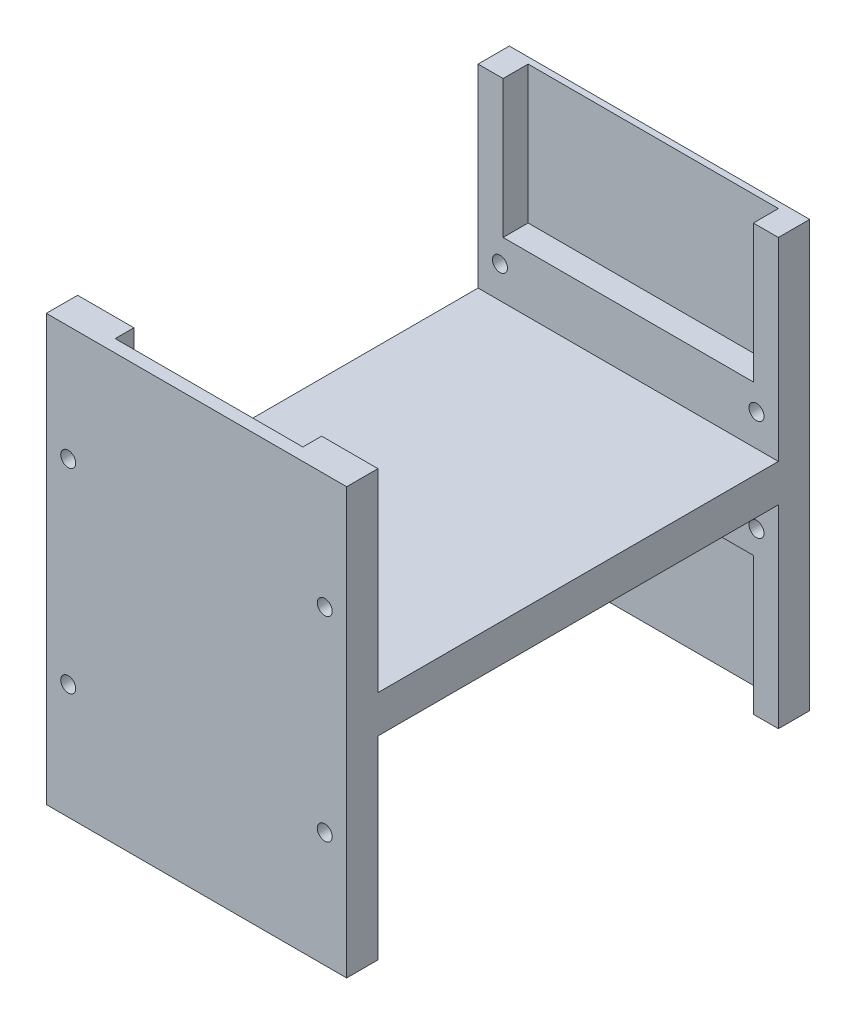
ISO-10303-21;
HEADER;
FILE_DESCRIPTION(('STEP AP214'),'2;1');
FILE_NAME('part.step','',(''),(''),'','','');
FILE_SCHEMA(('AUTOMOTIVE_DESIGN { 1 0 10303 214 1 1 1 1 }'));
ENDSEC;
DATA;
#1=APPLICATION_CONTEXT('core data for automotive mechanical design processes');
#2=APPLICATION_PROTOCOL_DEFINITION('international standard','automotive_design',2000,#1);
#3=PRODUCT_CONTEXT('',#1,'mechanical');
#4=PRODUCT('Part','Part','',(#3));
#5=PRODUCT_RELATED_PRODUCT_CATEGORY('part','',(#4));
#6=PRODUCT_DEFINITION_FORMATION('','',#4);
#7=PRODUCT_DEFINITION_CONTEXT('part definition',#1,'design');
#8=PRODUCT_DEFINITION('design','',#6,#7);
#9=PRODUCT_DEFINITION_SHAPE('','',#8);
#10=(LENGTH_UNIT() NAMED_UNIT(*) SI_UNIT(.MILLI.,.METRE.));
#11=(NAMED_UNIT(*) PLANE_ANGLE_UNIT() SI_UNIT($,.RADIAN.));
#12=(NAMED_UNIT(*) SI_UNIT($,.STERADIAN.) SOLID_ANGLE_UNIT());
#13=UNCERTAINTY_MEASURE_WITH_UNIT(LENGTH_MEASURE(1.E-05),#10,'distance_accuracy_value','');
#14=(GEOMETRIC_REPRESENTATION_CONTEXT(3) GLOBAL_UNCERTAINTY_ASSIGNED_CONTEXT((#13)) GLOBAL_UNIT_ASSIGNED_CONTEXT((#10,
#11,#12)) REPRESENTATION_CONTEXT('',''));
#15=CARTESIAN_POINT('',(0.,0.,0.));
#16=DIRECTION('',(0.,0.,1.));
#17=DIRECTION('',(1.,0.,0.));
#18=AXIS2_PLACEMENT_3D('',#15,#16,#17);
#19=CARTESIAN_POINT('',(0.,0.,37.));
#20=DIRECTION('',(1.,0.,0.));
#21=DIRECTION('',(0.,0.,-1.));
#22=AXIS2_PLACEMENT_3D('',#19,#20,#21);
#23=PLANE('',#22);
#24=DIRECTION('',(0.,-1.,0.));
#25=VECTOR('',#24,1.);
#26=CARTESIAN_POINT('',(0.,57.,34.5));
#27=LINE('',#26,#25);
#28=CARTESIAN_POINT('',(0.,15.5,34.5));
#29=VERTEX_POINT('',#28);
#30=CARTESIAN_POINT('',(0.,0.,34.5));
#31=VERTEX_POINT('',#30);
#32=EDGE_CURVE('E438',#29,#31,#27,.T.);
#33=ORIENTED_EDGE('',*,*,#32,.T.);
#34=DIRECTION('',(0.,0.,-1.));
#35=VECTOR('',#34,1.);
#36=CARTESIAN_POINT('',(0.,0.,37.));
#37=LINE('',#36,#35);
#38=CARTESIAN_POINT('',(0.,0.,37.));
#39=VERTEX_POINT('',#38);
#40=EDGE_CURVE('E12',#39,#31,#37,.T.);
#41=ORIENTED_EDGE('',*,*,#40,.F.);
#42=DIRECTION('',(0.,-1.,0.));
#43=VECTOR('',#42,1.);
#44=CARTESIAN_POINT('',(0.,0.,37.));
#45=LINE('',#44,#43);
#46=CARTESIAN_POINT('',(0.,34.,37.));
#47=VERTEX_POINT('',#46);
#48=EDGE_CURVE('E463',#47,#39,#45,.T.);
#49=ORIENTED_EDGE('',*,*,#48,.F.);
#50=DIRECTION('',(0.,0.,-1.));
#51=VECTOR('',#50,1.);
#52=CARTESIAN_POINT('',(0.,34.,37.));
#53=LINE('',#52,#51);
#54=CARTESIAN_POINT('',(0.,34.,34.5));
#55=VERTEX_POINT('',#54);
#56=EDGE_CURVE('E356',#47,#55,#53,.T.);
#57=ORIENTED_EDGE('',*,*,#56,.T.);
#58=DIRECTION('',(0.,1.,0.));
#59=VECTOR('',#58,1.);
#60=CARTESIAN_POINT('',(0.,-23.,34.5));
#61=LINE('',#60,#59);
#62=CARTESIAN_POINT('',(0.,18.5,34.5));
#63=VERTEX_POINT('',#62);
#64=EDGE_CURVE('E322',#63,#55,#61,.T.);
#65=ORIENTED_EDGE('',*,*,#64,.F.);
#66=DIRECTION('',(0.,0.,1.));
#67=VECTOR('',#66,1.);
#68=CARTESIAN_POINT('',(0.,18.5,0.));
#69=LINE('',#68,#67);
#70=CARTESIAN_POINT('',(0.,18.5,2.5));
#71=VERTEX_POINT('',#70);
#72=EDGE_CURVE('E324',#71,#63,#69,.T.);
#73=ORIENTED_EDGE('',*,*,#72,.F.);
#74=DIRECTION('',(0.,1.,0.));
#75=VECTOR('',#74,1.);
#76=CARTESIAN_POINT('',(0.,-23.,2.5));
#77=LINE('',#76,#75);
#78=CARTESIAN_POINT('',(0.,34.,2.5));
#79=VERTEX_POINT('',#78);
#80=EDGE_CURVE('E334',#71,#79,#77,.T.);
#81=ORIENTED_EDGE('',*,*,#80,.T.);
#82=CARTESIAN_POINT('',(0.,34.,0.));
#83=VERTEX_POINT('',#82);
#84=EDGE_CURVE('E355',#79,#83,#53,.T.);
#85=ORIENTED_EDGE('',*,*,#84,.T.);
#86=DIRECTION('',(0.,-1.,0.));
#87=VECTOR('',#86,1.);
#88=CARTESIAN_POINT('',(0.,0.,0.));
#89=LINE('',#88,#87);
#90=CARTESIAN_POINT('',(0.,0.,0.));
#91=VERTEX_POINT('',#90);
#92=EDGE_CURVE('E462',#83,#91,#89,.T.);
#93=ORIENTED_EDGE('',*,*,#92,.T.);
#94=CARTESIAN_POINT('',(0.,0.,2.5));
#95=VERTEX_POINT('',#94);
#96=EDGE_CURVE('E44',#95,#91,#37,.T.);
#97=ORIENTED_EDGE('',*,*,#96,.F.);
#98=DIRECTION('',(0.,-1.,0.));
#99=VECTOR('',#98,1.);
#100=CARTESIAN_POINT('',(0.,57.,2.5));
#101=LINE('',#100,#99);
#102=CARTESIAN_POINT('',(0.,15.5,2.5));
#103=VERTEX_POINT('',#102);
#104=EDGE_CURVE('E451',#103,#95,#101,.T.);
#105=ORIENTED_EDGE('',*,*,#104,.F.);
#106=DIRECTION('',(0.,0.,1.));
#107=VECTOR('',#106,1.);
#108=CARTESIAN_POINT('',(0.,15.5,0.));
#109=LINE('',#108,#107);
#110=EDGE_CURVE('E440',#103,#29,#109,.T.);
#111=ORIENTED_EDGE('',*,*,#110,.T.);
#112=EDGE_LOOP('',(#33,#41,#49,#57,#65,#73,#81,#85,#93,#97,#105,#111));
#113=FACE_BOUND('',#112,.T.);
#114=ADVANCED_FACE('F37',(#113),#23,.F.);
#115=CARTESIAN_POINT('',(0.,0.,37.));
#116=DIRECTION('',(0.,1.,0.));
#117=DIRECTION('',(0.,0.,1.));
#118=AXIS2_PLACEMENT_3D('',#115,#116,#117);
#119=PLANE('',#118);
#120=DIRECTION('',(1.,0.,0.));
#121=VECTOR('',#120,1.);
#122=CARTESIAN_POINT('',(0.,0.,34.5));
#123=LINE('',#122,#121);
#124=CARTESIAN_POINT('',(4.5,0.,34.5));
#125=VERTEX_POINT('',#124);
#126=EDGE_CURVE('E448',#31,#125,#123,.T.);
#127=ORIENTED_EDGE('',*,*,#126,.T.);
#128=DIRECTION('',(0.,0.,-1.));
#129=VECTOR('',#128,1.);
#130=CARTESIAN_POINT('',(4.5,0.,36.));
#131=LINE('',#130,#129);
#132=CARTESIAN_POINT('',(4.5,0.,36.));
#133=VERTEX_POINT('',#132);
#134=EDGE_CURVE('E359',#133,#125,#131,.T.);
#135=ORIENTED_EDGE('',*,*,#134,.F.);
#136=DIRECTION('',(-1.,0.,0.));
#137=VECTOR('',#136,1.);
#138=CARTESIAN_POINT('',(4.5,0.,36.));
#139=LINE('',#138,#137);
#140=CARTESIAN_POINT('',(19.5,0.,36.));
#141=VERTEX_POINT('',#140);
#142=EDGE_CURVE('E362',#141,#133,#139,.T.);
#143=ORIENTED_EDGE('',*,*,#142,.F.);
#144=DIRECTION('',(0.,0.,1.));
#145=VECTOR('',#144,1.);
#146=CARTESIAN_POINT('',(19.5,0.,36.));
#147=LINE('',#146,#145);
#148=CARTESIAN_POINT('',(19.5,0.,34.5));
#149=VERTEX_POINT('',#148);
#150=EDGE_CURVE('E371',#149,#141,#147,.T.);
#151=ORIENTED_EDGE('',*,*,#150,.F.);
#152=CARTESIAN_POINT('',(24.,0.,34.5));
#153=VERTEX_POINT('',#152);
#154=EDGE_CURVE('E447',#149,#153,#123,.T.);
#155=ORIENTED_EDGE('',*,*,#154,.T.);
#156=DIRECTION('',(0.,0.,-1.));
#157=VECTOR('',#156,1.);
#158=CARTESIAN_POINT('',(24.,0.,37.));
#159=LINE('',#158,#157);
#160=CARTESIAN_POINT('',(24.,0.,37.));
#161=VERTEX_POINT('',#160);
#162=EDGE_CURVE('E477',#161,#153,#159,.T.);
#163=ORIENTED_EDGE('',*,*,#162,.F.);
#164=DIRECTION('',(1.,0.,0.));
#165=VECTOR('',#164,1.);
#166=CARTESIAN_POINT('',(0.,0.,37.));
#167=LINE('',#166,#165);
#168=EDGE_CURVE('E466',#39,#161,#167,.T.);
#169=ORIENTED_EDGE('',*,*,#168,.F.);
#170=ORIENTED_EDGE('',*,*,#40,.T.);
#171=EDGE_LOOP('',(#127,#135,#143,#151,#155,#163,#169,#170));
#172=FACE_BOUND('',#171,.T.);
#173=ADVANCED_FACE('F527',(#172),#119,.F.);
#174=CARTESIAN_POINT('',(24.,0.,37.));
#175=DIRECTION('',(-1.,0.,0.));
#176=DIRECTION('',(0.,0.,1.));
#177=AXIS2_PLACEMENT_3D('',#174,#175,#176);
#178=PLANE('',#177);
#179=DIRECTION('',(0.,-1.,0.));
#180=VECTOR('',#179,1.);
#181=CARTESIAN_POINT('',(24.,57.,34.5));
#182=LINE('',#181,#180);
#183=CARTESIAN_POINT('',(24.,15.5,34.5));
#184=VERTEX_POINT('',#183);
#185=EDGE_CURVE('E454',#184,#153,#182,.T.);
#186=ORIENTED_EDGE('',*,*,#185,.F.);
#187=DIRECTION('',(0.,0.,-1.));
#188=VECTOR('',#187,1.);
#189=CARTESIAN_POINT('',(24.,15.5,0.));
#190=LINE('',#189,#188);
#191=CARTESIAN_POINT('',(24.,15.5,2.5));
#192=VERTEX_POINT('',#191);
#193=EDGE_CURVE('E434',#184,#192,#190,.T.);
#194=ORIENTED_EDGE('',*,*,#193,.T.);
#195=DIRECTION('',(0.,-1.,0.));
#196=VECTOR('',#195,1.);
#197=CARTESIAN_POINT('',(24.,57.,2.5));
#198=LINE('',#197,#196);
#199=CARTESIAN_POINT('',(24.,0.,2.5));
#200=VERTEX_POINT('',#199);
#201=EDGE_CURVE('E457',#192,#200,#198,.T.);
#202=ORIENTED_EDGE('',*,*,#201,.T.);
#203=CARTESIAN_POINT('',(24.,0.,0.));
#204=VERTEX_POINT('',#203);
#205=EDGE_CURVE('E471',#200,#204,#159,.T.);
#206=ORIENTED_EDGE('',*,*,#205,.T.);
#207=DIRECTION('',(0.,1.,0.));
#208=VECTOR('',#207,1.);
#209=CARTESIAN_POINT('',(24.,0.,0.));
#210=LINE('',#209,#208);
#211=CARTESIAN_POINT('',(24.,34.,0.));
#212=VERTEX_POINT('',#211);
#213=EDGE_CURVE('E467',#204,#212,#210,.T.);
#214=ORIENTED_EDGE('',*,*,#213,.T.);
#215=DIRECTION('',(0.,0.,-1.));
#216=VECTOR('',#215,1.);
#217=CARTESIAN_POINT('',(24.,34.,37.));
#218=LINE('',#217,#216);
#219=CARTESIAN_POINT('',(24.,34.,2.5));
#220=VERTEX_POINT('',#219);
#221=EDGE_CURVE('E349',#220,#212,#218,.T.);
#222=ORIENTED_EDGE('',*,*,#221,.F.);
#223=DIRECTION('',(0.,1.,0.));
#224=VECTOR('',#223,1.);
#225=CARTESIAN_POINT('',(24.,-23.,2.5));
#226=LINE('',#225,#224);
#227=CARTESIAN_POINT('',(24.,18.5,2.5));
#228=VERTEX_POINT('',#227);
#229=EDGE_CURVE('E339',#228,#220,#226,.T.);
#230=ORIENTED_EDGE('',*,*,#229,.F.);
#231=DIRECTION('',(0.,0.,-1.));
#232=VECTOR('',#231,1.);
#233=CARTESIAN_POINT('',(24.,18.5,0.));
#234=LINE('',#233,#232);
#235=CARTESIAN_POINT('',(24.,18.5,34.5));
#236=VERTEX_POINT('',#235);
#237=EDGE_CURVE('E318',#236,#228,#234,.T.);
#238=ORIENTED_EDGE('',*,*,#237,.F.);
#239=DIRECTION('',(0.,1.,0.));
#240=VECTOR('',#239,1.);
#241=CARTESIAN_POINT('',(24.,-23.,34.5));
#242=LINE('',#241,#240);
#243=CARTESIAN_POINT('',(24.,34.,34.5));
#244=VERTEX_POINT('',#243);
#245=EDGE_CURVE('E337',#236,#244,#242,.T.);
#246=ORIENTED_EDGE('',*,*,#245,.T.);
#247=CARTESIAN_POINT('',(24.,34.,37.));
#248=VERTEX_POINT('',#247);
#249=EDGE_CURVE('E352',#248,#244,#218,.T.);
#250=ORIENTED_EDGE('',*,*,#249,.F.);
#251=DIRECTION('',(0.,1.,0.));
#252=VECTOR('',#251,1.);
#253=CARTESIAN_POINT('',(24.,0.,37.));
#254=LINE('',#253,#252);
#255=EDGE_CURVE('E469',#161,#248,#254,.T.);
#256=ORIENTED_EDGE('',*,*,#255,.F.);
#257=ORIENTED_EDGE('',*,*,#162,.T.);
#258=EDGE_LOOP('',(#186,#194,#202,#206,#214,#222,#230,#238,#246,#250,#256,#257));
#259=FACE_BOUND('',#258,.T.);
#260=ADVANCED_FACE('F484',(#259),#178,.F.);
#261=DIRECTION('',(1.,0.,0.));
#262=VECTOR('',#261,1.);
#263=CARTESIAN_POINT('',(2.,0.,0.499999999999995));
#264=LINE('',#263,#262);
#265=CARTESIAN_POINT('',(2.,0.,0.499999999999995));
#266=VERTEX_POINT('',#265);
#267=CARTESIAN_POINT('',(22.,0.,0.499999999999998));
#268=VERTEX_POINT('',#267);
#269=EDGE_CURVE('E397',#266,#268,#264,.T.);
#270=ORIENTED_EDGE('',*,*,#269,.F.);
#271=DIRECTION('',(0.,0.,-1.));
#272=VECTOR('',#271,1.);
#273=CARTESIAN_POINT('',(2.,0.,2.5));
#274=LINE('',#273,#272);
#275=CARTESIAN_POINT('',(2.,0.,2.5));
#276=VERTEX_POINT('',#275);
#277=EDGE_CURVE('E378',#276,#266,#274,.T.);
#278=ORIENTED_EDGE('',*,*,#277,.F.);
#279=DIRECTION('',(1.,0.,0.));
#280=VECTOR('',#279,1.);
#281=CARTESIAN_POINT('',(0.,0.,2.5));
#282=LINE('',#281,#280);
#283=EDGE_CURVE('E444',#95,#276,#282,.T.);
#284=ORIENTED_EDGE('',*,*,#283,.F.);
#285=ORIENTED_EDGE('',*,*,#96,.T.);
#286=DIRECTION('',(1.,0.,0.));
#287=VECTOR('',#286,1.);
#288=CARTESIAN_POINT('',(0.,0.,0.));
#289=LINE('',#288,#287);
#290=EDGE_CURVE('E474',#91,#204,#289,.T.);
#291=ORIENTED_EDGE('',*,*,#290,.T.);
#292=ORIENTED_EDGE('',*,*,#205,.F.);
#293=CARTESIAN_POINT('',(22.,0.,2.5));
#294=VERTEX_POINT('',#293);
#295=EDGE_CURVE('E429',#294,#200,#282,.T.);
#296=ORIENTED_EDGE('',*,*,#295,.F.);
#297=DIRECTION('',(0.,0.,1.));
#298=VECTOR('',#297,1.);
#299=CARTESIAN_POINT('',(22.,0.,2.5));
#300=LINE('',#299,#298);
#301=EDGE_CURVE('E389',#268,#294,#300,.T.);
#302=ORIENTED_EDGE('',*,*,#301,.F.);
#303=EDGE_LOOP('',(#270,#278,#284,#285,#291,#292,#296,#302));
#304=FACE_BOUND('',#303,.T.);
#305=ADVANCED_FACE('F492',(#304),#119,.F.);
#306=CARTESIAN_POINT('',(0.,0.,37.));
#307=DIRECTION('',(0.,0.,-1.));
#308=DIRECTION('',(-1.,0.,0.));
#309=AXIS2_PLACEMENT_3D('',#306,#307,#308);
#310=PLANE('',#309);
#311=CARTESIAN_POINT('',(1.75,9.2,37.));
#312=DIRECTION('',(0.,0.,1.));
#313=DIRECTION('',(1.,0.,0.));
#314=AXIS2_PLACEMENT_3D('',#311,#312,#313);
#315=CIRCLE('',#314,0.6);
#316=CARTESIAN_POINT('',(2.35,9.2,37.));
#317=VERTEX_POINT('',#316);
#318=EDGE_CURVE('E425',#317,#317,#315,.T.);
#319=ORIENTED_EDGE('',*,*,#318,.F.);
#320=EDGE_LOOP('',(#319));
#321=FACE_BOUND('',#320,.T.);
#322=CARTESIAN_POINT('',(22.25,9.2,37.));
#323=DIRECTION('',(0.,0.,1.));
#324=DIRECTION('',(1.,0.,0.));
#325=AXIS2_PLACEMENT_3D('',#322,#323,#324);
#326=CIRCLE('',#325,0.6);
#327=CARTESIAN_POINT('',(22.85,9.2,37.));
#328=VERTEX_POINT('',#327);
#329=EDGE_CURVE('E426',#328,#328,#326,.T.);
#330=ORIENTED_EDGE('',*,*,#329,.F.);
#331=EDGE_LOOP('',(#330));
#332=FACE_BOUND('',#331,.T.);
#333=ORIENTED_EDGE('',*,*,#48,.T.);
#334=ORIENTED_EDGE('',*,*,#168,.T.);
#335=ORIENTED_EDGE('',*,*,#255,.T.);
#336=DIRECTION('',(1.,0.,0.));
#337=VECTOR('',#336,1.);
#338=CARTESIAN_POINT('',(0.,34.,37.));
#339=LINE('',#338,#337);
#340=EDGE_CURVE('E346',#47,#248,#339,.T.);
#341=ORIENTED_EDGE('',*,*,#340,.F.);
#342=EDGE_LOOP('',(#333,#334,#335,#341));
#343=FACE_BOUND('',#342,.T.);
#344=CARTESIAN_POINT('',(1.75,24.8,37.));
#345=DIRECTION('',(0.,0.,-1.));
#346=DIRECTION('',(1.,0.,0.));
#347=AXIS2_PLACEMENT_3D('',#344,#345,#346);
#348=CIRCLE('',#347,0.6);
#349=CARTESIAN_POINT('',(2.35,24.8,37.));
#350=VERTEX_POINT('',#349);
#351=EDGE_CURVE('E309',#350,#350,#348,.T.);
#352=ORIENTED_EDGE('',*,*,#351,.T.);
#353=EDGE_LOOP('',(#352));
#354=FACE_BOUND('',#353,.T.);
#355=CARTESIAN_POINT('',(22.25,24.8,37.));
#356=DIRECTION('',(0.,0.,-1.));
#357=DIRECTION('',(1.,0.,0.));
#358=AXIS2_PLACEMENT_3D('',#355,#356,#357);
#359=CIRCLE('',#358,0.6);
#360=CARTESIAN_POINT('',(22.85,24.8,37.));
#361=VERTEX_POINT('',#360);
#362=EDGE_CURVE('E310',#361,#361,#359,.T.);
#363=ORIENTED_EDGE('',*,*,#362,.T.);
#364=EDGE_LOOP('',(#363));
#365=FACE_BOUND('',#364,.T.);
#366=ADVANCED_FACE('F523',(#321,#332,#343,#354,#365),#310,.F.);
#367=CARTESIAN_POINT('',(0.,0.,0.));
#368=DIRECTION('',(0.,0.,-1.));
#369=DIRECTION('',(-1.,0.,0.));
#370=AXIS2_PLACEMENT_3D('',#367,#368,#369);
#371=PLANE('',#370);
#372=CARTESIAN_POINT('',(22.25,12.95,0.));
#373=DIRECTION('',(0.,0.,-1.));
#374=DIRECTION('',(-1.,0.,0.));
#375=AXIS2_PLACEMENT_3D('',#372,#373,#374);
#376=CIRCLE('',#375,0.6);
#377=CARTESIAN_POINT('',(21.65,12.95,0.));
#378=VERTEX_POINT('',#377);
#379=EDGE_CURVE('E410',#378,#378,#376,.T.);
#380=ORIENTED_EDGE('',*,*,#379,.F.);
#381=EDGE_LOOP('',(#380));
#382=FACE_BOUND('',#381,.T.);
#383=CARTESIAN_POINT('',(1.75,12.95,0.));
#384=DIRECTION('',(0.,0.,-1.));
#385=DIRECTION('',(-1.,0.,0.));
#386=AXIS2_PLACEMENT_3D('',#383,#384,#385);
#387=CIRCLE('',#386,0.6);
#388=CARTESIAN_POINT('',(1.15,12.95,0.));
#389=VERTEX_POINT('',#388);
#390=EDGE_CURVE('E403',#389,#389,#387,.T.);
#391=ORIENTED_EDGE('',*,*,#390,.F.);
#392=EDGE_LOOP('',(#391));
#393=FACE_BOUND('',#392,.T.);
#394=ORIENTED_EDGE('',*,*,#92,.F.);
#395=DIRECTION('',(1.,0.,0.));
#396=VECTOR('',#395,1.);
#397=CARTESIAN_POINT('',(0.,34.,0.));
#398=LINE('',#397,#396);
#399=EDGE_CURVE('E345',#83,#212,#398,.T.);
#400=ORIENTED_EDGE('',*,*,#399,.T.);
#401=ORIENTED_EDGE('',*,*,#213,.F.);
#402=ORIENTED_EDGE('',*,*,#290,.F.);
#403=EDGE_LOOP('',(#394,#400,#401,#402));
#404=FACE_BOUND('',#403,.T.);
#405=CARTESIAN_POINT('',(22.25,21.05,0.));
#406=DIRECTION('',(0.,0.,1.));
#407=DIRECTION('',(-1.,0.,0.));
#408=AXIS2_PLACEMENT_3D('',#405,#406,#407);
#409=CIRCLE('',#408,0.6);
#410=CARTESIAN_POINT('',(21.65,21.05,0.));
#411=VERTEX_POINT('',#410);
#412=EDGE_CURVE('E294',#411,#411,#409,.T.);
#413=ORIENTED_EDGE('',*,*,#412,.T.);
#414=EDGE_LOOP('',(#413));
#415=FACE_BOUND('',#414,.T.);
#416=CARTESIAN_POINT('',(1.75,21.05,0.));
#417=DIRECTION('',(0.,0.,1.));
#418=DIRECTION('',(-1.,0.,0.));
#419=AXIS2_PLACEMENT_3D('',#416,#417,#418);
#420=CIRCLE('',#419,0.6);
#421=CARTESIAN_POINT('',(1.15,21.05,0.));
#422=VERTEX_POINT('',#421);
#423=EDGE_CURVE('E288',#422,#422,#420,.T.);
#424=ORIENTED_EDGE('',*,*,#423,.T.);
#425=EDGE_LOOP('',(#424));
#426=FACE_BOUND('',#425,.T.);
#427=ADVANCED_FACE('F496',(#382,#393,#404,#415,#426),#371,.T.);
#428=CARTESIAN_POINT('',(0.,57.,34.5));
#429=DIRECTION('',(0.,0.,-1.));
#430=DIRECTION('',(-1.,0.,0.));
#431=AXIS2_PLACEMENT_3D('',#428,#429,#430);
#432=PLANE('',#431);
#433=DIRECTION('',(0.,-1.,0.));
#434=VECTOR('',#433,1.);
#435=CARTESIAN_POINT('',(4.5,15.,34.5));
#436=LINE('',#435,#434);
#437=CARTESIAN_POINT('',(4.5,15.,34.5));
#438=VERTEX_POINT('',#437);
#439=EDGE_CURVE('E369',#438,#125,#436,.T.);
#440=ORIENTED_EDGE('',*,*,#439,.T.);
#441=ORIENTED_EDGE('',*,*,#126,.F.);
#442=ORIENTED_EDGE('',*,*,#32,.F.);
#443=DIRECTION('',(-1.,0.,0.));
#444=VECTOR('',#443,1.);
#445=CARTESIAN_POINT('',(0.,15.5,34.5));
#446=LINE('',#445,#444);
#447=EDGE_CURVE('E437',#184,#29,#446,.T.);
#448=ORIENTED_EDGE('',*,*,#447,.F.);
#449=ORIENTED_EDGE('',*,*,#185,.T.);
#450=ORIENTED_EDGE('',*,*,#154,.F.);
#451=DIRECTION('',(0.,-1.,0.));
#452=VECTOR('',#451,1.);
#453=CARTESIAN_POINT('',(19.5,15.,34.5));
#454=LINE('',#453,#452);
#455=CARTESIAN_POINT('',(19.5,15.,34.5));
#456=VERTEX_POINT('',#455);
#457=EDGE_CURVE('E381',#456,#149,#454,.T.);
#458=ORIENTED_EDGE('',*,*,#457,.F.);
#459=DIRECTION('',(1.,0.,0.));
#460=VECTOR('',#459,1.);
#461=CARTESIAN_POINT('',(4.5,15.,34.5));
#462=LINE('',#461,#460);
#463=EDGE_CURVE('E361',#438,#456,#462,.T.);
#464=ORIENTED_EDGE('',*,*,#463,.F.);
#465=EDGE_LOOP('',(#440,#441,#442,#448,#449,#450,#458,#464));
#466=FACE_BOUND('',#465,.T.);
#467=CARTESIAN_POINT('',(1.75,9.2,34.5));
#468=DIRECTION('',(0.,0.,-1.));
#469=DIRECTION('',(-1.,0.,0.));
#470=AXIS2_PLACEMENT_3D('',#467,#468,#469);
#471=CIRCLE('',#470,0.6);
#472=CARTESIAN_POINT('',(1.15,9.2,34.5));
#473=VERTEX_POINT('',#472);
#474=EDGE_CURVE('E422',#473,#473,#471,.F.);
#475=ORIENTED_EDGE('',*,*,#474,.T.);
#476=EDGE_LOOP('',(#475));
#477=FACE_BOUND('',#476,.T.);
#478=CARTESIAN_POINT('',(22.25,9.2,34.5));
#479=DIRECTION('',(0.,0.,-1.));
#480=DIRECTION('',(-1.,0.,0.));
#481=AXIS2_PLACEMENT_3D('',#478,#479,#480);
#482=CIRCLE('',#481,0.6);
#483=CARTESIAN_POINT('',(21.65,9.2,34.5));
#484=VERTEX_POINT('',#483);
#485=EDGE_CURVE('E417',#484,#484,#482,.F.);
#486=ORIENTED_EDGE('',*,*,#485,.T.);
#487=EDGE_LOOP('',(#486));
#488=FACE_BOUND('',#487,.T.);
#489=ADVANCED_FACE('F533',(#466,#477,#488),#432,.T.);
#490=CARTESIAN_POINT('',(0.,57.,2.5));
#491=DIRECTION('',(0.,0.,-1.));
#492=DIRECTION('',(-1.,0.,0.));
#493=AXIS2_PLACEMENT_3D('',#490,#491,#492);
#494=PLANE('',#493);
#495=ORIENTED_EDGE('',*,*,#283,.T.);
#496=DIRECTION('',(0.,-1.,0.));
#497=VECTOR('',#496,1.);
#498=CARTESIAN_POINT('',(2.,11.,2.5));
#499=LINE('',#498,#497);
#500=CARTESIAN_POINT('',(2.,11.,2.5));
#501=VERTEX_POINT('',#500);
#502=EDGE_CURVE('E401',#501,#276,#499,.T.);
#503=ORIENTED_EDGE('',*,*,#502,.F.);
#504=DIRECTION('',(-1.,0.,0.));
#505=VECTOR('',#504,1.);
#506=CARTESIAN_POINT('',(2.,11.,2.5));
#507=LINE('',#506,#505);
#508=CARTESIAN_POINT('',(22.,11.,2.5));
#509=VERTEX_POINT('',#508);
#510=EDGE_CURVE('E392',#509,#501,#507,.T.);
#511=ORIENTED_EDGE('',*,*,#510,.F.);
#512=DIRECTION('',(0.,-1.,0.));
#513=VECTOR('',#512,1.);
#514=CARTESIAN_POINT('',(22.,11.,2.5));
#515=LINE('',#514,#513);
#516=EDGE_CURVE('E404',#509,#294,#515,.T.);
#517=ORIENTED_EDGE('',*,*,#516,.T.);
#518=ORIENTED_EDGE('',*,*,#295,.T.);
#519=ORIENTED_EDGE('',*,*,#201,.F.);
#520=DIRECTION('',(-1.,0.,0.));
#521=VECTOR('',#520,1.);
#522=CARTESIAN_POINT('',(0.,15.5,2.5));
#523=LINE('',#522,#521);
#524=EDGE_CURVE('E443',#192,#103,#523,.T.);
#525=ORIENTED_EDGE('',*,*,#524,.T.);
#526=ORIENTED_EDGE('',*,*,#104,.T.);
#527=EDGE_LOOP('',(#495,#503,#511,#517,#518,#519,#525,#526));
#528=FACE_BOUND('',#527,.T.);
#529=CARTESIAN_POINT('',(22.25,12.95,2.5));
#530=DIRECTION('',(0.,0.,-1.));
#531=DIRECTION('',(-1.,0.,0.));
#532=AXIS2_PLACEMENT_3D('',#529,#530,#531);
#533=CIRCLE('',#532,0.6);
#534=CARTESIAN_POINT('',(21.65,12.95,2.5));
#535=VERTEX_POINT('',#534);
#536=EDGE_CURVE('E413',#535,#535,#533,.F.);
#537=ORIENTED_EDGE('',*,*,#536,.F.);
#538=EDGE_LOOP('',(#537));
#539=FACE_BOUND('',#538,.T.);
#540=CARTESIAN_POINT('',(1.75,12.95,2.5));
#541=DIRECTION('',(0.,0.,-1.));
#542=DIRECTION('',(-1.,0.,0.));
#543=AXIS2_PLACEMENT_3D('',#540,#541,#542);
#544=CIRCLE('',#543,0.6);
#545=CARTESIAN_POINT('',(1.15,12.95,2.5));
#546=VERTEX_POINT('',#545);
#547=EDGE_CURVE('E414',#546,#546,#544,.F.);
#548=ORIENTED_EDGE('',*,*,#547,.F.);
#549=EDGE_LOOP('',(#548));
#550=FACE_BOUND('',#549,.T.);
#551=ADVANCED_FACE('F542',(#528,#539,#550),#494,.F.);
#552=CARTESIAN_POINT('',(0.,15.5,37.));
#553=DIRECTION('',(0.,-1.,0.));
#554=DIRECTION('',(0.,0.,-1.));
#555=AXIS2_PLACEMENT_3D('',#552,#553,#554);
#556=PLANE('',#555);
#557=ORIENTED_EDGE('',*,*,#110,.F.);
#558=ORIENTED_EDGE('',*,*,#524,.F.);
#559=ORIENTED_EDGE('',*,*,#193,.F.);
#560=ORIENTED_EDGE('',*,*,#447,.T.);
#561=EDGE_LOOP('',(#557,#558,#559,#560));
#562=FACE_BOUND('',#561,.T.);
#563=ADVANCED_FACE('F539',(#562),#556,.T.);
#564=CARTESIAN_POINT('',(22.25,9.2,-0.001000000000001));
#565=DIRECTION('',(0.,0.,1.));
#566=DIRECTION('',(1.,0.,0.));
#567=AXIS2_PLACEMENT_3D('',#564,#565,#566);
#568=CYLINDRICAL_SURFACE('',#567,0.6);
#569=ORIENTED_EDGE('',*,*,#485,.F.);
#570=EDGE_LOOP('',(#569));
#571=FACE_BOUND('',#570,.T.);
#572=ORIENTED_EDGE('',*,*,#329,.T.);
#573=EDGE_LOOP('',(#572));
#574=FACE_BOUND('',#573,.T.);
#575=ADVANCED_FACE('F612',(#571,#574),#568,.F.);
#576=CARTESIAN_POINT('',(1.75,9.2,-0.001000000000001));
#577=DIRECTION('',(0.,0.,1.));
#578=DIRECTION('',(1.,0.,0.));
#579=AXIS2_PLACEMENT_3D('',#576,#577,#578);
#580=CYLINDRICAL_SURFACE('',#579,0.6);
#581=ORIENTED_EDGE('',*,*,#474,.F.);
#582=EDGE_LOOP('',(#581));
#583=FACE_BOUND('',#582,.T.);
#584=ORIENTED_EDGE('',*,*,#318,.T.);
#585=EDGE_LOOP('',(#584));
#586=FACE_BOUND('',#585,.T.);
#587=ADVANCED_FACE('F615',(#583,#586),#580,.F.);
#588=CARTESIAN_POINT('',(1.75,12.95,37.001));
#589=DIRECTION('',(0.,0.,-1.));
#590=DIRECTION('',(-1.,0.,0.));
#591=AXIS2_PLACEMENT_3D('',#588,#589,#590);
#592=CYLINDRICAL_SURFACE('',#591,0.6);
#593=ORIENTED_EDGE('',*,*,#390,.T.);
#594=EDGE_LOOP('',(#593));
#595=FACE_BOUND('',#594,.T.);
#596=ORIENTED_EDGE('',*,*,#547,.T.);
#597=EDGE_LOOP('',(#596));
#598=FACE_BOUND('',#597,.T.);
#599=ADVANCED_FACE('F619',(#595,#598),#592,.F.);
#600=CARTESIAN_POINT('',(22.25,12.95,37.001));
#601=DIRECTION('',(0.,0.,-1.));
#602=DIRECTION('',(-1.,0.,0.));
#603=AXIS2_PLACEMENT_3D('',#600,#601,#602);
#604=CYLINDRICAL_SURFACE('',#603,0.6);
#605=ORIENTED_EDGE('',*,*,#379,.T.);
#606=EDGE_LOOP('',(#605));
#607=FACE_BOUND('',#606,.T.);
#608=ORIENTED_EDGE('',*,*,#536,.T.);
#609=EDGE_LOOP('',(#608));
#610=FACE_BOUND('',#609,.T.);
#611=ADVANCED_FACE('F623',(#607,#610),#604,.F.);
#612=CARTESIAN_POINT('',(2.,11.,2.5));
#613=DIRECTION('',(-1.,0.,0.));
#614=DIRECTION('',(0.,0.,1.));
#615=AXIS2_PLACEMENT_3D('',#612,#613,#614);
#616=PLANE('',#615);
#617=ORIENTED_EDGE('',*,*,#277,.T.);
#618=DIRECTION('',(0.,-1.,0.));
#619=VECTOR('',#618,1.);
#620=CARTESIAN_POINT('',(2.,11.,0.499999999999995));
#621=LINE('',#620,#619);
#622=CARTESIAN_POINT('',(2.,11.,0.499999999999995));
#623=VERTEX_POINT('',#622);
#624=EDGE_CURVE('E394',#623,#266,#621,.T.);
#625=ORIENTED_EDGE('',*,*,#624,.F.);
#626=DIRECTION('',(0.,0.,-1.));
#627=VECTOR('',#626,1.);
#628=CARTESIAN_POINT('',(2.,11.,2.5));
#629=LINE('',#628,#627);
#630=EDGE_CURVE('E385',#501,#623,#629,.T.);
#631=ORIENTED_EDGE('',*,*,#630,.F.);
#632=ORIENTED_EDGE('',*,*,#502,.T.);
#633=EDGE_LOOP('',(#617,#625,#631,#632));
#634=FACE_BOUND('',#633,.T.);
#635=ADVANCED_FACE('F553',(#634),#616,.F.);
#636=CARTESIAN_POINT('',(22.,11.,2.5));
#637=DIRECTION('',(1.,0.,0.));
#638=DIRECTION('',(0.,0.,-1.));
#639=AXIS2_PLACEMENT_3D('',#636,#637,#638);
#640=PLANE('',#639);
#641=ORIENTED_EDGE('',*,*,#301,.T.);
#642=ORIENTED_EDGE('',*,*,#516,.F.);
#643=DIRECTION('',(0.,0.,1.));
#644=VECTOR('',#643,1.);
#645=CARTESIAN_POINT('',(22.,11.,2.5));
#646=LINE('',#645,#644);
#647=CARTESIAN_POINT('',(22.,11.,0.499999999999998));
#648=VERTEX_POINT('',#647);
#649=EDGE_CURVE('E59',#648,#509,#646,.T.);
#650=ORIENTED_EDGE('',*,*,#649,.F.);
#651=DIRECTION('',(0.,-1.,0.));
#652=VECTOR('',#651,1.);
#653=CARTESIAN_POINT('',(22.,11.,0.499999999999998));
#654=LINE('',#653,#652);
#655=EDGE_CURVE('E407',#648,#268,#654,.T.);
#656=ORIENTED_EDGE('',*,*,#655,.T.);
#657=EDGE_LOOP('',(#641,#642,#650,#656));
#658=FACE_BOUND('',#657,.T.);
#659=ADVANCED_FACE('F548',(#658),#640,.F.);
#660=CARTESIAN_POINT('',(2.,11.,0.499999999999995));
#661=DIRECTION('',(0.,0.,-1.));
#662=DIRECTION('',(-1.,0.,0.));
#663=AXIS2_PLACEMENT_3D('',#660,#661,#662);
#664=PLANE('',#663);
#665=ORIENTED_EDGE('',*,*,#269,.T.);
#666=ORIENTED_EDGE('',*,*,#655,.F.);
#667=DIRECTION('',(1.,0.,0.));
#668=VECTOR('',#667,1.);
#669=CARTESIAN_POINT('',(2.,11.,0.499999999999995));
#670=LINE('',#669,#668);
#671=EDGE_CURVE('E388',#623,#648,#670,.T.);
#672=ORIENTED_EDGE('',*,*,#671,.F.);
#673=ORIENTED_EDGE('',*,*,#624,.T.);
#674=EDGE_LOOP('',(#665,#666,#672,#673));
#675=FACE_BOUND('',#674,.T.);
#676=ADVANCED_FACE('F551',(#675),#664,.F.);
#677=CARTESIAN_POINT('',(0.,11.,0.));
#678=DIRECTION('',(0.,-1.,0.));
#679=DIRECTION('',(0.,0.,-1.));
#680=AXIS2_PLACEMENT_3D('',#677,#678,#679);
#681=PLANE('',#680);
#682=ORIENTED_EDGE('',*,*,#630,.T.);
#683=ORIENTED_EDGE('',*,*,#671,.T.);
#684=ORIENTED_EDGE('',*,*,#649,.T.);
#685=ORIENTED_EDGE('',*,*,#510,.T.);
#686=EDGE_LOOP('',(#682,#683,#684,#685));
#687=FACE_BOUND('',#686,.T.);
#688=ADVANCED_FACE('F632',(#687),#681,.T.);
#689=CARTESIAN_POINT('',(4.5,15.,36.));
#690=DIRECTION('',(-1.,0.,0.));
#691=DIRECTION('',(0.,0.,1.));
#692=AXIS2_PLACEMENT_3D('',#689,#690,#691);
#693=PLANE('',#692);
#694=ORIENTED_EDGE('',*,*,#134,.T.);
#695=ORIENTED_EDGE('',*,*,#439,.F.);
#696=DIRECTION('',(0.,0.,-1.));
#697=VECTOR('',#696,1.);
#698=CARTESIAN_POINT('',(4.5,15.,36.));
#699=LINE('',#698,#697);
#700=CARTESIAN_POINT('',(4.5,15.,36.));
#701=VERTEX_POINT('',#700);
#702=EDGE_CURVE('E51',#701,#438,#699,.T.);
#703=ORIENTED_EDGE('',*,*,#702,.F.);
#704=DIRECTION('',(0.,-1.,0.));
#705=VECTOR('',#704,1.);
#706=CARTESIAN_POINT('',(4.5,15.,36.));
#707=LINE('',#706,#705);
#708=EDGE_CURVE('E376',#701,#133,#707,.T.);
#709=ORIENTED_EDGE('',*,*,#708,.T.);
#710=EDGE_LOOP('',(#694,#695,#703,#709));
#711=FACE_BOUND('',#710,.T.);
#712=ADVANCED_FACE('F637',(#711),#693,.F.);
#713=CARTESIAN_POINT('',(4.5,15.,36.));
#714=DIRECTION('',(0.,0.,1.));
#715=DIRECTION('',(1.,0.,0.));
#716=AXIS2_PLACEMENT_3D('',#713,#714,#715);
#717=PLANE('',#716);
#718=ORIENTED_EDGE('',*,*,#142,.T.);
#719=ORIENTED_EDGE('',*,*,#708,.F.);
#720=DIRECTION('',(-1.,0.,0.));
#721=VECTOR('',#720,1.);
#722=CARTESIAN_POINT('',(4.5,15.,36.));
#723=LINE('',#722,#721);
#724=CARTESIAN_POINT('',(19.5,15.,36.));
#725=VERTEX_POINT('',#724);
#726=EDGE_CURVE('E367',#725,#701,#723,.T.);
#727=ORIENTED_EDGE('',*,*,#726,.F.);
#728=DIRECTION('',(0.,-1.,0.));
#729=VECTOR('',#728,1.);
#730=CARTESIAN_POINT('',(19.5,15.,36.));
#731=LINE('',#730,#729);
#732=EDGE_CURVE('E379',#725,#141,#731,.T.);
#733=ORIENTED_EDGE('',*,*,#732,.T.);
#734=EDGE_LOOP('',(#718,#719,#727,#733));
#735=FACE_BOUND('',#734,.T.);
#736=ADVANCED_FACE('F640',(#735),#717,.F.);
#737=CARTESIAN_POINT('',(19.5,15.,36.));
#738=DIRECTION('',(1.,0.,0.));
#739=DIRECTION('',(0.,0.,-1.));
#740=AXIS2_PLACEMENT_3D('',#737,#738,#739);
#741=PLANE('',#740);
#742=ORIENTED_EDGE('',*,*,#150,.T.);
#743=ORIENTED_EDGE('',*,*,#732,.F.);
#744=DIRECTION('',(0.,0.,1.));
#745=VECTOR('',#744,1.);
#746=CARTESIAN_POINT('',(19.5,15.,36.));
#747=LINE('',#746,#745);
#748=EDGE_CURVE('E364',#456,#725,#747,.T.);
#749=ORIENTED_EDGE('',*,*,#748,.F.);
#750=ORIENTED_EDGE('',*,*,#457,.T.);
#751=EDGE_LOOP('',(#742,#743,#749,#750));
#752=FACE_BOUND('',#751,.T.);
#753=ADVANCED_FACE('F642',(#752),#741,.F.);
#754=CARTESIAN_POINT('',(0.,15.,0.));
#755=DIRECTION('',(0.,-1.,0.));
#756=DIRECTION('',(0.,0.,-1.));
#757=AXIS2_PLACEMENT_3D('',#754,#755,#756);
#758=PLANE('',#757);
#759=ORIENTED_EDGE('',*,*,#702,.T.);
#760=ORIENTED_EDGE('',*,*,#463,.T.);
#761=ORIENTED_EDGE('',*,*,#748,.T.);
#762=ORIENTED_EDGE('',*,*,#726,.T.);
#763=EDGE_LOOP('',(#759,#760,#761,#762));
#764=FACE_BOUND('',#763,.T.);
#765=ADVANCED_FACE('F645',(#764),#758,.T.);
#766=CARTESIAN_POINT('',(0.,34.,37.));
#767=DIRECTION('',(0.,-1.,0.));
#768=DIRECTION('',(0.,0.,1.));
#769=AXIS2_PLACEMENT_3D('',#766,#767,#768);
#770=PLANE('',#769);
#771=DIRECTION('',(1.,0.,0.));
#772=VECTOR('',#771,1.);
#773=CARTESIAN_POINT('',(0.,34.,34.5));
#774=LINE('',#773,#772);
#775=CARTESIAN_POINT('',(4.5,34.,34.5));
#776=VERTEX_POINT('',#775);
#777=EDGE_CURVE('E332',#55,#776,#774,.T.);
#778=ORIENTED_EDGE('',*,*,#777,.F.);
#779=ORIENTED_EDGE('',*,*,#56,.F.);
#780=ORIENTED_EDGE('',*,*,#340,.T.);
#781=ORIENTED_EDGE('',*,*,#249,.T.);
#782=CARTESIAN_POINT('',(19.5,34.,34.5));
#783=VERTEX_POINT('',#782);
#784=EDGE_CURVE('E331',#783,#244,#774,.T.);
#785=ORIENTED_EDGE('',*,*,#784,.F.);
#786=DIRECTION('',(0.,0.,1.));
#787=VECTOR('',#786,1.);
#788=CARTESIAN_POINT('',(19.5,34.,36.));
#789=LINE('',#788,#787);
#790=CARTESIAN_POINT('',(19.5,34.,36.));
#791=VERTEX_POINT('',#790);
#792=EDGE_CURVE('E240',#783,#791,#789,.T.);
#793=ORIENTED_EDGE('',*,*,#792,.T.);
#794=DIRECTION('',(-1.,0.,0.));
#795=VECTOR('',#794,1.);
#796=CARTESIAN_POINT('',(4.5,34.,36.));
#797=LINE('',#796,#795);
#798=CARTESIAN_POINT('',(4.5,34.,36.));
#799=VERTEX_POINT('',#798);
#800=EDGE_CURVE('E252',#791,#799,#797,.T.);
#801=ORIENTED_EDGE('',*,*,#800,.T.);
#802=DIRECTION('',(0.,0.,-1.));
#803=VECTOR('',#802,1.);
#804=CARTESIAN_POINT('',(4.5,34.,36.));
#805=LINE('',#804,#803);
#806=EDGE_CURVE('E256',#799,#776,#805,.T.);
#807=ORIENTED_EDGE('',*,*,#806,.T.);
#808=EDGE_LOOP('',(#778,#779,#780,#781,#785,#793,#801,#807));
#809=FACE_BOUND('',#808,.T.);
#810=ADVANCED_FACE('F521',(#809),#770,.F.);
#811=DIRECTION('',(1.,0.,0.));
#812=VECTOR('',#811,1.);
#813=CARTESIAN_POINT('',(2.,34.,0.499999999999995));
#814=LINE('',#813,#812);
#815=CARTESIAN_POINT('',(2.,34.,0.499999999999995));
#816=VERTEX_POINT('',#815);
#817=CARTESIAN_POINT('',(22.,34.,0.499999999999998));
#818=VERTEX_POINT('',#817);
#819=EDGE_CURVE('E281',#816,#818,#814,.T.);
#820=ORIENTED_EDGE('',*,*,#819,.T.);
#821=DIRECTION('',(0.,0.,1.));
#822=VECTOR('',#821,1.);
#823=CARTESIAN_POINT('',(22.,34.,2.5));
#824=LINE('',#823,#822);
#825=CARTESIAN_POINT('',(22.,34.,2.5));
#826=VERTEX_POINT('',#825);
#827=EDGE_CURVE('E271',#818,#826,#824,.T.);
#828=ORIENTED_EDGE('',*,*,#827,.T.);
#829=DIRECTION('',(1.,0.,0.));
#830=VECTOR('',#829,1.);
#831=CARTESIAN_POINT('',(0.,34.,2.5));
#832=LINE('',#831,#830);
#833=EDGE_CURVE('E313',#826,#220,#832,.T.);
#834=ORIENTED_EDGE('',*,*,#833,.T.);
#835=ORIENTED_EDGE('',*,*,#221,.T.);
#836=ORIENTED_EDGE('',*,*,#399,.F.);
#837=ORIENTED_EDGE('',*,*,#84,.F.);
#838=CARTESIAN_POINT('',(2.,34.,2.5));
#839=VERTEX_POINT('',#838);
#840=EDGE_CURVE('E328',#79,#839,#832,.T.);
#841=ORIENTED_EDGE('',*,*,#840,.T.);
#842=DIRECTION('',(0.,0.,-1.));
#843=VECTOR('',#842,1.);
#844=CARTESIAN_POINT('',(2.,34.,2.5));
#845=LINE('',#844,#843);
#846=EDGE_CURVE('E264',#839,#816,#845,.T.);
#847=ORIENTED_EDGE('',*,*,#846,.T.);
#848=EDGE_LOOP('',(#820,#828,#834,#835,#836,#837,#841,#847));
#849=FACE_BOUND('',#848,.T.);
#850=ADVANCED_FACE('F503',(#849),#770,.F.);
#851=CARTESIAN_POINT('',(0.,-23.,34.5));
#852=DIRECTION('',(0.,0.,-1.));
#853=DIRECTION('',(-1.,0.,0.));
#854=AXIS2_PLACEMENT_3D('',#851,#852,#853);
#855=PLANE('',#854);
#856=DIRECTION('',(0.,1.,0.));
#857=VECTOR('',#856,1.);
#858=CARTESIAN_POINT('',(4.5,19.,34.5));
#859=LINE('',#858,#857);
#860=CARTESIAN_POINT('',(4.5,19.,34.5));
#861=VERTEX_POINT('',#860);
#862=EDGE_CURVE('E245',#861,#776,#859,.T.);
#863=ORIENTED_EDGE('',*,*,#862,.F.);
#864=DIRECTION('',(1.,0.,0.));
#865=VECTOR('',#864,1.);
#866=CARTESIAN_POINT('',(4.5,19.,34.5));
#867=LINE('',#866,#865);
#868=CARTESIAN_POINT('',(19.5,19.,34.5));
#869=VERTEX_POINT('',#868);
#870=EDGE_CURVE('E230',#861,#869,#867,.T.);
#871=ORIENTED_EDGE('',*,*,#870,.T.);
#872=DIRECTION('',(0.,1.,0.));
#873=VECTOR('',#872,1.);
#874=CARTESIAN_POINT('',(19.5,19.,34.5));
#875=LINE('',#874,#873);
#876=EDGE_CURVE('E237',#869,#783,#875,.T.);
#877=ORIENTED_EDGE('',*,*,#876,.T.);
#878=ORIENTED_EDGE('',*,*,#784,.T.);
#879=ORIENTED_EDGE('',*,*,#245,.F.);
#880=DIRECTION('',(-1.,0.,0.));
#881=VECTOR('',#880,1.);
#882=CARTESIAN_POINT('',(0.,18.5,34.5));
#883=LINE('',#882,#881);
#884=EDGE_CURVE('E321',#236,#63,#883,.T.);
#885=ORIENTED_EDGE('',*,*,#884,.T.);
#886=ORIENTED_EDGE('',*,*,#64,.T.);
#887=ORIENTED_EDGE('',*,*,#777,.T.);
#888=EDGE_LOOP('',(#863,#871,#877,#878,#879,#885,#886,#887));
#889=FACE_BOUND('',#888,.T.);
#890=CARTESIAN_POINT('',(1.75,24.8,34.5));
#891=DIRECTION('',(0.,0.,1.));
#892=DIRECTION('',(-1.,0.,0.));
#893=AXIS2_PLACEMENT_3D('',#890,#891,#892);
#894=CIRCLE('',#893,0.6);
#895=CARTESIAN_POINT('',(1.15,24.8,34.5));
#896=VERTEX_POINT('',#895);
#897=EDGE_CURVE('E306',#896,#896,#894,.F.);
#898=ORIENTED_EDGE('',*,*,#897,.F.);
#899=EDGE_LOOP('',(#898));
#900=FACE_BOUND('',#899,.T.);
#901=CARTESIAN_POINT('',(22.25,24.8,34.5));
#902=DIRECTION('',(0.,0.,1.));
#903=DIRECTION('',(-1.,0.,0.));
#904=AXIS2_PLACEMENT_3D('',#901,#902,#903);
#905=CIRCLE('',#904,0.6);
#906=CARTESIAN_POINT('',(21.65,24.8,34.5));
#907=VERTEX_POINT('',#906);
#908=EDGE_CURVE('E301',#907,#907,#905,.F.);
#909=ORIENTED_EDGE('',*,*,#908,.F.);
#910=EDGE_LOOP('',(#909));
#911=FACE_BOUND('',#910,.T.);
#912=ADVANCED_FACE('F247',(#889,#900,#911),#855,.T.);
#913=CARTESIAN_POINT('',(0.,-23.,2.5));
#914=DIRECTION('',(0.,0.,-1.));
#915=DIRECTION('',(-1.,0.,0.));
#916=AXIS2_PLACEMENT_3D('',#913,#914,#915);
#917=PLANE('',#916);
#918=ORIENTED_EDGE('',*,*,#840,.F.);
#919=ORIENTED_EDGE('',*,*,#80,.F.);
#920=DIRECTION('',(-1.,0.,0.));
#921=VECTOR('',#920,1.);
#922=CARTESIAN_POINT('',(0.,18.5,2.5));
#923=LINE('',#922,#921);
#924=EDGE_CURVE('E327',#228,#71,#923,.T.);
#925=ORIENTED_EDGE('',*,*,#924,.F.);
#926=ORIENTED_EDGE('',*,*,#229,.T.);
#927=ORIENTED_EDGE('',*,*,#833,.F.);
#928=DIRECTION('',(0.,1.,0.));
#929=VECTOR('',#928,1.);
#930=CARTESIAN_POINT('',(22.,23.,2.5));
#931=LINE('',#930,#929);
#932=CARTESIAN_POINT('',(22.,23.,2.5));
#933=VERTEX_POINT('',#932);
#934=EDGE_CURVE('E289',#933,#826,#931,.T.);
#935=ORIENTED_EDGE('',*,*,#934,.F.);
#936=DIRECTION('',(-1.,0.,0.));
#937=VECTOR('',#936,1.);
#938=CARTESIAN_POINT('',(2.,23.,2.5));
#939=LINE('',#938,#937);
#940=CARTESIAN_POINT('',(2.,23.,2.5));
#941=VERTEX_POINT('',#940);
#942=EDGE_CURVE('E275',#933,#941,#939,.T.);
#943=ORIENTED_EDGE('',*,*,#942,.T.);
#944=DIRECTION('',(0.,1.,0.));
#945=VECTOR('',#944,1.);
#946=CARTESIAN_POINT('',(2.,23.,2.5));
#947=LINE('',#946,#945);
#948=EDGE_CURVE('E286',#941,#839,#947,.T.);
#949=ORIENTED_EDGE('',*,*,#948,.T.);
#950=EDGE_LOOP('',(#918,#919,#925,#926,#927,#935,#943,#949));
#951=FACE_BOUND('',#950,.T.);
#952=CARTESIAN_POINT('',(22.25,21.05,2.5));
#953=DIRECTION('',(0.,0.,1.));
#954=DIRECTION('',(-1.,0.,0.));
#955=AXIS2_PLACEMENT_3D('',#952,#953,#954);
#956=CIRCLE('',#955,0.6);
#957=CARTESIAN_POINT('',(21.65,21.05,2.5));
#958=VERTEX_POINT('',#957);
#959=EDGE_CURVE('E297',#958,#958,#956,.F.);
#960=ORIENTED_EDGE('',*,*,#959,.T.);
#961=EDGE_LOOP('',(#960));
#962=FACE_BOUND('',#961,.T.);
#963=CARTESIAN_POINT('',(1.75,21.05,2.5));
#964=DIRECTION('',(0.,0.,1.));
#965=DIRECTION('',(-1.,0.,0.));
#966=AXIS2_PLACEMENT_3D('',#963,#964,#965);
#967=CIRCLE('',#966,0.6);
#968=CARTESIAN_POINT('',(1.15,21.05,2.5));
#969=VERTEX_POINT('',#968);
#970=EDGE_CURVE('E298',#969,#969,#967,.F.);
#971=ORIENTED_EDGE('',*,*,#970,.T.);
#972=EDGE_LOOP('',(#971));
#973=FACE_BOUND('',#972,.T.);
#974=ADVANCED_FACE('F509',(#951,#962,#973),#917,.F.);
#975=CARTESIAN_POINT('',(0.,18.5,37.));
#976=DIRECTION('',(0.,1.,0.));
#977=DIRECTION('',(0.,0.,-1.));
#978=AXIS2_PLACEMENT_3D('',#975,#976,#977);
#979=PLANE('',#978);
#980=ORIENTED_EDGE('',*,*,#72,.T.);
#981=ORIENTED_EDGE('',*,*,#884,.F.);
#982=ORIENTED_EDGE('',*,*,#237,.T.);
#983=ORIENTED_EDGE('',*,*,#924,.T.);
#984=EDGE_LOOP('',(#980,#981,#982,#983));
#985=FACE_BOUND('',#984,.T.);
#986=ADVANCED_FACE('F515',(#985),#979,.T.);
#987=CARTESIAN_POINT('',(22.25,24.8,-0.001000000000001));
#988=DIRECTION('',(0.,0.,1.));
#989=DIRECTION('',(1.,0.,0.));
#990=AXIS2_PLACEMENT_3D('',#987,#988,#989);
#991=CYLINDRICAL_SURFACE('',#990,0.6);
#992=ORIENTED_EDGE('',*,*,#908,.T.);
#993=EDGE_LOOP('',(#992));
#994=FACE_BOUND('',#993,.T.);
#995=ORIENTED_EDGE('',*,*,#362,.F.);
#996=EDGE_LOOP('',(#995));
#997=FACE_BOUND('',#996,.T.);
#998=ADVANCED_FACE('F660',(#994,#997),#991,.F.);
#999=CARTESIAN_POINT('',(1.75,24.8,-0.001000000000001));
#1000=DIRECTION('',(0.,0.,1.));
#1001=DIRECTION('',(1.,0.,0.));
#1002=AXIS2_PLACEMENT_3D('',#999,#1000,#1001);
#1003=CYLINDRICAL_SURFACE('',#1002,0.6);
#1004=ORIENTED_EDGE('',*,*,#897,.T.);
#1005=EDGE_LOOP('',(#1004));
#1006=FACE_BOUND('',#1005,.T.);
#1007=ORIENTED_EDGE('',*,*,#351,.F.);
#1008=EDGE_LOOP('',(#1007));
#1009=FACE_BOUND('',#1008,.T.);
#1010=ADVANCED_FACE('F663',(#1006,#1009),#1003,.F.);
#1011=CARTESIAN_POINT('',(1.75,21.05,37.001));
#1012=DIRECTION('',(0.,0.,-1.));
#1013=DIRECTION('',(-1.,0.,0.));
#1014=AXIS2_PLACEMENT_3D('',#1011,#1012,#1013);
#1015=CYLINDRICAL_SURFACE('',#1014,0.6);
#1016=ORIENTED_EDGE('',*,*,#423,.F.);
#1017=EDGE_LOOP('',(#1016));
#1018=FACE_BOUND('',#1017,.T.);
#1019=ORIENTED_EDGE('',*,*,#970,.F.);
#1020=EDGE_LOOP('',(#1019));
#1021=FACE_BOUND('',#1020,.T.);
#1022=ADVANCED_FACE('F667',(#1018,#1021),#1015,.F.);
#1023=CARTESIAN_POINT('',(22.25,21.05,37.001));
#1024=DIRECTION('',(0.,0.,-1.));
#1025=DIRECTION('',(-1.,0.,0.));
#1026=AXIS2_PLACEMENT_3D('',#1023,#1024,#1025);
#1027=CYLINDRICAL_SURFACE('',#1026,0.6);
#1028=ORIENTED_EDGE('',*,*,#412,.F.);
#1029=EDGE_LOOP('',(#1028));
#1030=FACE_BOUND('',#1029,.T.);
#1031=ORIENTED_EDGE('',*,*,#959,.F.);
#1032=EDGE_LOOP('',(#1031));
#1033=FACE_BOUND('',#1032,.T.);
#1034=ADVANCED_FACE('F671',(#1030,#1033),#1027,.F.);
#1035=CARTESIAN_POINT('',(2.,23.,2.5));
#1036=DIRECTION('',(-1.,0.,0.));
#1037=DIRECTION('',(0.,0.,1.));
#1038=AXIS2_PLACEMENT_3D('',#1035,#1036,#1037);
#1039=PLANE('',#1038);
#1040=ORIENTED_EDGE('',*,*,#846,.F.);
#1041=ORIENTED_EDGE('',*,*,#948,.F.);
#1042=DIRECTION('',(0.,0.,-1.));
#1043=VECTOR('',#1042,1.);
#1044=CARTESIAN_POINT('',(2.,23.,2.5));
#1045=LINE('',#1044,#1043);
#1046=CARTESIAN_POINT('',(2.,23.,0.499999999999995));
#1047=VERTEX_POINT('',#1046);
#1048=EDGE_CURVE('E267',#941,#1047,#1045,.T.);
#1049=ORIENTED_EDGE('',*,*,#1048,.T.);
#1050=DIRECTION('',(0.,1.,0.));
#1051=VECTOR('',#1050,1.);
#1052=CARTESIAN_POINT('',(2.,23.,0.499999999999995));
#1053=LINE('',#1052,#1051);
#1054=EDGE_CURVE('E278',#1047,#816,#1053,.T.);
#1055=ORIENTED_EDGE('',*,*,#1054,.T.);
#1056=EDGE_LOOP('',(#1040,#1041,#1049,#1055));
#1057=FACE_BOUND('',#1056,.T.);
#1058=ADVANCED_FACE('F561',(#1057),#1039,.F.);
#1059=CARTESIAN_POINT('',(22.,23.,2.5));
#1060=DIRECTION('',(1.,0.,0.));
#1061=DIRECTION('',(0.,0.,-1.));
#1062=AXIS2_PLACEMENT_3D('',#1059,#1060,#1061);
#1063=PLANE('',#1062);
#1064=ORIENTED_EDGE('',*,*,#827,.F.);
#1065=DIRECTION('',(0.,1.,0.));
#1066=VECTOR('',#1065,1.);
#1067=CARTESIAN_POINT('',(22.,23.,0.499999999999998));
#1068=LINE('',#1067,#1066);
#1069=CARTESIAN_POINT('',(22.,23.,0.499999999999998));
#1070=VERTEX_POINT('',#1069);
#1071=EDGE_CURVE('E291',#1070,#818,#1068,.T.);
#1072=ORIENTED_EDGE('',*,*,#1071,.F.);
#1073=DIRECTION('',(0.,0.,1.));
#1074=VECTOR('',#1073,1.);
#1075=CARTESIAN_POINT('',(22.,23.,2.5));
#1076=LINE('',#1075,#1074);
#1077=EDGE_CURVE('E273',#1070,#933,#1076,.T.);
#1078=ORIENTED_EDGE('',*,*,#1077,.T.);
#1079=ORIENTED_EDGE('',*,*,#934,.T.);
#1080=EDGE_LOOP('',(#1064,#1072,#1078,#1079));
#1081=FACE_BOUND('',#1080,.T.);
#1082=ADVANCED_FACE('F569',(#1081),#1063,.F.);
#1083=CARTESIAN_POINT('',(2.,23.,0.499999999999995));
#1084=DIRECTION('',(0.,0.,-1.));
#1085=DIRECTION('',(-1.,0.,0.));
#1086=AXIS2_PLACEMENT_3D('',#1083,#1084,#1085);
#1087=PLANE('',#1086);
#1088=ORIENTED_EDGE('',*,*,#819,.F.);
#1089=ORIENTED_EDGE('',*,*,#1054,.F.);
#1090=DIRECTION('',(1.,0.,0.));
#1091=VECTOR('',#1090,1.);
#1092=CARTESIAN_POINT('',(2.,23.,0.499999999999995));
#1093=LINE('',#1092,#1091);
#1094=EDGE_CURVE('E270',#1047,#1070,#1093,.T.);
#1095=ORIENTED_EDGE('',*,*,#1094,.T.);
#1096=ORIENTED_EDGE('',*,*,#1071,.T.);
#1097=EDGE_LOOP('',(#1088,#1089,#1095,#1096));
#1098=FACE_BOUND('',#1097,.T.);
#1099=ADVANCED_FACE('F564',(#1098),#1087,.F.);
#1100=CARTESIAN_POINT('',(0.,23.,0.));
#1101=DIRECTION('',(0.,1.,0.));
#1102=DIRECTION('',(0.,0.,-1.));
#1103=AXIS2_PLACEMENT_3D('',#1100,#1101,#1102);
#1104=PLANE('',#1103);
#1105=ORIENTED_EDGE('',*,*,#1048,.F.);
#1106=ORIENTED_EDGE('',*,*,#942,.F.);
#1107=ORIENTED_EDGE('',*,*,#1077,.F.);
#1108=ORIENTED_EDGE('',*,*,#1094,.F.);
#1109=EDGE_LOOP('',(#1105,#1106,#1107,#1108));
#1110=FACE_BOUND('',#1109,.T.);
#1111=ADVANCED_FACE('F571',(#1110),#1104,.T.);
#1112=CARTESIAN_POINT('',(4.5,19.,36.));
#1113=DIRECTION('',(-1.,0.,0.));
#1114=DIRECTION('',(0.,0.,1.));
#1115=AXIS2_PLACEMENT_3D('',#1112,#1113,#1114);
#1116=PLANE('',#1115);
#1117=ORIENTED_EDGE('',*,*,#806,.F.);
#1118=DIRECTION('',(0.,1.,0.));
#1119=VECTOR('',#1118,1.);
#1120=CARTESIAN_POINT('',(4.5,19.,36.));
#1121=LINE('',#1120,#1119);
#1122=CARTESIAN_POINT('',(4.5,19.,36.));
#1123=VERTEX_POINT('',#1122);
#1124=EDGE_CURVE('E262',#1123,#799,#1121,.T.);
#1125=ORIENTED_EDGE('',*,*,#1124,.F.);
#1126=DIRECTION('',(0.,0.,-1.));
#1127=VECTOR('',#1126,1.);
#1128=CARTESIAN_POINT('',(4.5,19.,36.));
#1129=LINE('',#1128,#1127);
#1130=EDGE_CURVE('E250',#1123,#861,#1129,.T.);
#1131=ORIENTED_EDGE('',*,*,#1130,.T.);
#1132=ORIENTED_EDGE('',*,*,#862,.T.);
#1133=EDGE_LOOP('',(#1117,#1125,#1131,#1132));
#1134=FACE_BOUND('',#1133,.T.);
#1135=ADVANCED_FACE('F573',(#1134),#1116,.F.);
#1136=CARTESIAN_POINT('',(4.5,19.,36.));
#1137=DIRECTION('',(0.,0.,1.));
#1138=DIRECTION('',(1.,0.,0.));
#1139=AXIS2_PLACEMENT_3D('',#1136,#1137,#1138);
#1140=PLANE('',#1139);
#1141=ORIENTED_EDGE('',*,*,#800,.F.);
#1142=DIRECTION('',(0.,1.,0.));
#1143=VECTOR('',#1142,1.);
#1144=CARTESIAN_POINT('',(19.5,19.,36.));
#1145=LINE('',#1144,#1143);
#1146=CARTESIAN_POINT('',(19.5,19.,36.));
#1147=VERTEX_POINT('',#1146);
#1148=EDGE_CURVE('E244',#1147,#791,#1145,.T.);
#1149=ORIENTED_EDGE('',*,*,#1148,.F.);
#1150=DIRECTION('',(-1.,0.,0.));
#1151=VECTOR('',#1150,1.);
#1152=CARTESIAN_POINT('',(4.5,19.,36.));
#1153=LINE('',#1152,#1151);
#1154=EDGE_CURVE('E232',#1147,#1123,#1153,.T.);
#1155=ORIENTED_EDGE('',*,*,#1154,.T.);
#1156=ORIENTED_EDGE('',*,*,#1124,.T.);
#1157=EDGE_LOOP('',(#1141,#1149,#1155,#1156));
#1158=FACE_BOUND('',#1157,.T.);
#1159=ADVANCED_FACE('F579',(#1158),#1140,.F.);
#1160=CARTESIAN_POINT('',(19.5,19.,36.));
#1161=DIRECTION('',(1.,0.,0.));
#1162=DIRECTION('',(0.,0.,-1.));
#1163=AXIS2_PLACEMENT_3D('',#1160,#1161,#1162);
#1164=PLANE('',#1163);
#1165=ORIENTED_EDGE('',*,*,#792,.F.);
#1166=ORIENTED_EDGE('',*,*,#876,.F.);
#1167=DIRECTION('',(0.,0.,1.));
#1168=VECTOR('',#1167,1.);
#1169=CARTESIAN_POINT('',(19.5,19.,36.));
#1170=LINE('',#1169,#1168);
#1171=EDGE_CURVE('E225',#869,#1147,#1170,.T.);
#1172=ORIENTED_EDGE('',*,*,#1171,.T.);
#1173=ORIENTED_EDGE('',*,*,#1148,.T.);
#1174=EDGE_LOOP('',(#1165,#1166,#1172,#1173));
#1175=FACE_BOUND('',#1174,.T.);
#1176=ADVANCED_FACE('F238',(#1175),#1164,.F.);
#1177=CARTESIAN_POINT('',(0.,19.,0.));
#1178=DIRECTION('',(0.,1.,0.));
#1179=DIRECTION('',(0.,0.,-1.));
#1180=AXIS2_PLACEMENT_3D('',#1177,#1178,#1179);
#1181=PLANE('',#1180);
#1182=ORIENTED_EDGE('',*,*,#1130,.F.);
#1183=ORIENTED_EDGE('',*,*,#1154,.F.);
#1184=ORIENTED_EDGE('',*,*,#1171,.F.);
#1185=ORIENTED_EDGE('',*,*,#870,.F.);
#1186=EDGE_LOOP('',(#1182,#1183,#1184,#1185));
#1187=FACE_BOUND('',#1186,.T.);
#1188=ADVANCED_FACE('F228',(#1187),#1181,.T.);
#1189=CLOSED_SHELL('',(#114,#173,#260,#305,#366,#427,#489,#551,#563,#575,#587,#599,#611,#635,
#659,#676,#688,#712,#736,#753,#765,#810,#850,#912,#974,#986,#998,#1010,#1022,#1034,#1058,#1082,
#1099,#1111,#1135,#1159,#1176,#1188));
#1190=MANIFOLD_SOLID_BREP('B2',#1189);
#1191=ADVANCED_BREP_SHAPE_REPRESENTATION('',(#18,#1190),#14);
#1192=SHAPE_DEFINITION_REPRESENTATION(#9,#1191);
ENDSEC;
END-ISO-10303-21;
